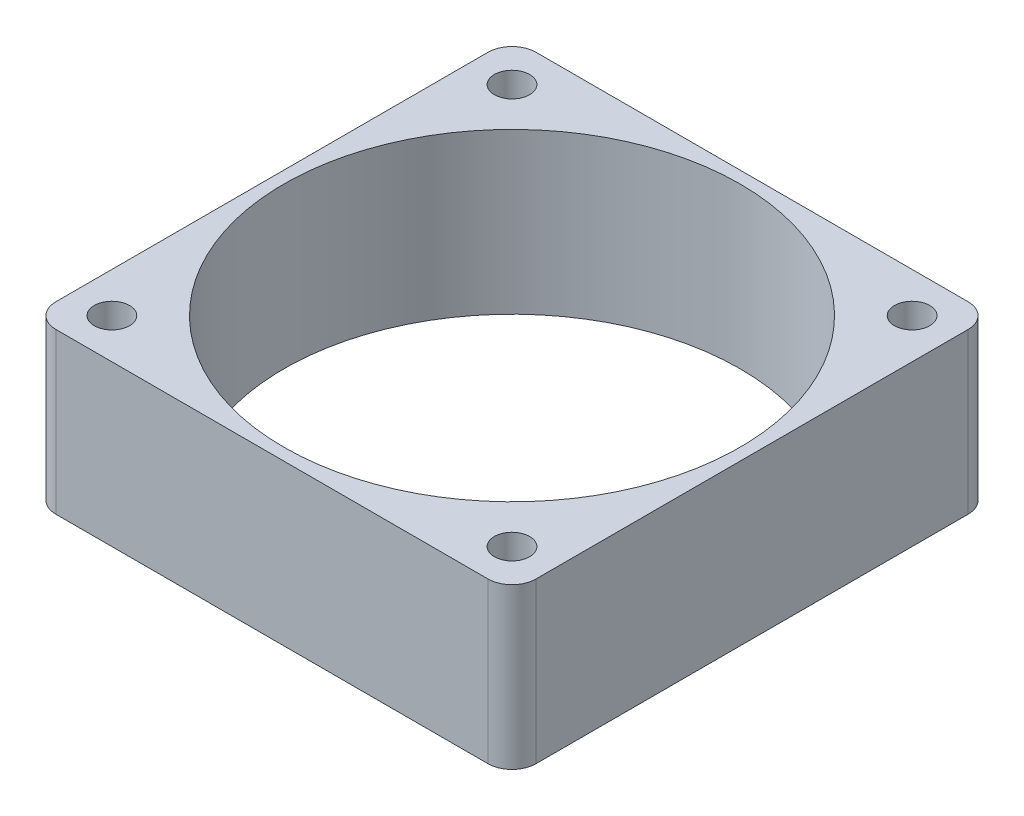
ISO-10303-21;
HEADER;
FILE_DESCRIPTION(('STEP AP214'),'2;1');
FILE_NAME('part.step','',(''),(''),'','','');
FILE_SCHEMA(('AUTOMOTIVE_DESIGN { 1 0 10303 214 1 1 1 1 }'));
ENDSEC;
DATA;
#1=APPLICATION_CONTEXT('core data for automotive mechanical design processes');
#2=APPLICATION_PROTOCOL_DEFINITION('international standard','automotive_design',2000,#1);
#3=PRODUCT_CONTEXT('',#1,'mechanical');
#4=PRODUCT('Part','Part','',(#3));
#5=PRODUCT_RELATED_PRODUCT_CATEGORY('part','',(#4));
#6=PRODUCT_DEFINITION_FORMATION('','',#4);
#7=PRODUCT_DEFINITION_CONTEXT('part definition',#1,'design');
#8=PRODUCT_DEFINITION('design','',#6,#7);
#9=PRODUCT_DEFINITION_SHAPE('','',#8);
#10=(LENGTH_UNIT() NAMED_UNIT(*) SI_UNIT(.MILLI.,.METRE.));
#11=(NAMED_UNIT(*) PLANE_ANGLE_UNIT() SI_UNIT($,.RADIAN.));
#12=(NAMED_UNIT(*) SI_UNIT($,.STERADIAN.) SOLID_ANGLE_UNIT());
#13=UNCERTAINTY_MEASURE_WITH_UNIT(LENGTH_MEASURE(1.E-05),#10,'distance_accuracy_value','');
#14=(GEOMETRIC_REPRESENTATION_CONTEXT(3) GLOBAL_UNCERTAINTY_ASSIGNED_CONTEXT((#13)) GLOBAL_UNIT_ASSIGNED_CONTEXT((#10,
#11,#12)) REPRESENTATION_CONTEXT('',''));
#15=CARTESIAN_POINT('',(0.,0.,0.));
#16=DIRECTION('',(0.,0.,1.));
#17=DIRECTION('',(1.,0.,0.));
#18=AXIS2_PLACEMENT_3D('',#15,#16,#17);
#19=CARTESIAN_POINT('',(0.,20.,0.));
#20=DIRECTION('',(0.,1.,0.));
#21=DIRECTION('',(0.,0.,1.));
#22=AXIS2_PLACEMENT_3D('',#19,#20,#21);
#23=PLANE('',#22);
#24=CARTESIAN_POINT('',(54.9999999999998,20.,5.));
#25=DIRECTION('',(0.,1.,0.));
#26=DIRECTION('',(0.,0.,1.));
#27=AXIS2_PLACEMENT_3D('',#24,#25,#26);
#28=CIRCLE('',#27,2.20000000000001);
#29=CARTESIAN_POINT('',(54.9999999999998,20.,7.2));
#30=VERTEX_POINT('',#29);
#31=EDGE_CURVE('E191',#30,#30,#28,.T.);
#32=ORIENTED_EDGE('',*,*,#31,.F.);
#33=EDGE_LOOP('',(#32));
#34=FACE_BOUND('',#33,.T.);
#35=CARTESIAN_POINT('',(30.,20.,30.));
#36=DIRECTION('',(0.,1.,0.));
#37=DIRECTION('',(0.,0.,1.));
#38=AXIS2_PLACEMENT_3D('',#35,#36,#37);
#39=CIRCLE('',#38,28.5);
#40=CARTESIAN_POINT('',(30.,20.,58.5));
#41=VERTEX_POINT('',#40);
#42=EDGE_CURVE('E180',#41,#41,#39,.T.);
#43=ORIENTED_EDGE('',*,*,#42,.F.);
#44=EDGE_LOOP('',(#43));
#45=FACE_BOUND('',#44,.T.);
#46=DIRECTION('',(-1.,0.,0.));
#47=VECTOR('',#46,1.);
#48=CARTESIAN_POINT('',(0.,20.,0.));
#49=LINE('',#48,#47);
#50=CARTESIAN_POINT('',(57.,20.,0.));
#51=VERTEX_POINT('',#50);
#52=CARTESIAN_POINT('',(3.,20.,0.));
#53=VERTEX_POINT('',#52);
#54=EDGE_CURVE('E135',#51,#53,#49,.T.);
#55=ORIENTED_EDGE('',*,*,#54,.T.);
#56=CARTESIAN_POINT('',(3.,20.,3.));
#57=DIRECTION('',(0.,1.,0.));
#58=DIRECTION('',(0.,0.,1.));
#59=AXIS2_PLACEMENT_3D('',#56,#57,#58);
#60=CIRCLE('',#59,3.);
#61=CARTESIAN_POINT('',(0.,20.,3.));
#62=VERTEX_POINT('',#61);
#63=EDGE_CURVE('E154',#53,#62,#60,.T.);
#64=ORIENTED_EDGE('',*,*,#63,.T.);
#65=DIRECTION('',(0.,0.,1.));
#66=VECTOR('',#65,1.);
#67=CARTESIAN_POINT('',(0.,20.,0.));
#68=LINE('',#67,#66);
#69=CARTESIAN_POINT('',(0.,20.,57.));
#70=VERTEX_POINT('',#69);
#71=EDGE_CURVE('E118',#62,#70,#68,.T.);
#72=ORIENTED_EDGE('',*,*,#71,.T.);
#73=CARTESIAN_POINT('',(3.,20.,57.));
#74=DIRECTION('',(0.,1.,0.));
#75=DIRECTION('',(0.,0.,1.));
#76=AXIS2_PLACEMENT_3D('',#73,#74,#75);
#77=CIRCLE('',#76,3.);
#78=CARTESIAN_POINT('',(3.,20.,60.));
#79=VERTEX_POINT('',#78);
#80=EDGE_CURVE('E149',#70,#79,#77,.T.);
#81=ORIENTED_EDGE('',*,*,#80,.T.);
#82=DIRECTION('',(1.,0.,0.));
#83=VECTOR('',#82,1.);
#84=CARTESIAN_POINT('',(0.,20.,60.));
#85=LINE('',#84,#83);
#86=CARTESIAN_POINT('',(57.,20.,60.));
#87=VERTEX_POINT('',#86);
#88=EDGE_CURVE('E165',#79,#87,#85,.T.);
#89=ORIENTED_EDGE('',*,*,#88,.T.);
#90=CARTESIAN_POINT('',(57.,20.,57.));
#91=DIRECTION('',(0.,1.,0.));
#92=DIRECTION('',(0.,0.,1.));
#93=AXIS2_PLACEMENT_3D('',#90,#91,#92);
#94=CIRCLE('',#93,3.);
#95=CARTESIAN_POINT('',(60.,20.,57.));
#96=VERTEX_POINT('',#95);
#97=EDGE_CURVE('E54',#87,#96,#94,.T.);
#98=ORIENTED_EDGE('',*,*,#97,.T.);
#99=DIRECTION('',(0.,0.,-1.));
#100=VECTOR('',#99,1.);
#101=CARTESIAN_POINT('',(60.,20.,0.));
#102=LINE('',#101,#100);
#103=CARTESIAN_POINT('',(60.,20.,3.));
#104=VERTEX_POINT('',#103);
#105=EDGE_CURVE('E173',#96,#104,#102,.T.);
#106=ORIENTED_EDGE('',*,*,#105,.T.);
#107=CARTESIAN_POINT('',(57.,20.,3.));
#108=DIRECTION('',(0.,1.,0.));
#109=DIRECTION('',(0.,0.,1.));
#110=AXIS2_PLACEMENT_3D('',#107,#108,#109);
#111=CIRCLE('',#110,3.);
#112=EDGE_CURVE('E152',#104,#51,#111,.T.);
#113=ORIENTED_EDGE('',*,*,#112,.T.);
#114=EDGE_LOOP('',(#55,#64,#72,#81,#89,#98,#106,#113));
#115=FACE_BOUND('',#114,.T.);
#116=CARTESIAN_POINT('',(5.00000000000001,20.,55.));
#117=DIRECTION('',(0.,1.,0.));
#118=DIRECTION('',(0.,0.,1.));
#119=AXIS2_PLACEMENT_3D('',#116,#117,#118);
#120=CIRCLE('',#119,2.2);
#121=CARTESIAN_POINT('',(5.00000000000001,20.,57.2));
#122=VERTEX_POINT('',#121);
#123=EDGE_CURVE('E126',#122,#122,#120,.T.);
#124=ORIENTED_EDGE('',*,*,#123,.F.);
#125=EDGE_LOOP('',(#124));
#126=FACE_BOUND('',#125,.T.);
#127=CARTESIAN_POINT('',(55.,20.,55.));
#128=DIRECTION('',(0.,1.,0.));
#129=DIRECTION('',(0.,0.,1.));
#130=AXIS2_PLACEMENT_3D('',#127,#128,#129);
#131=CIRCLE('',#130,2.2);
#132=CARTESIAN_POINT('',(55.,20.,57.2));
#133=VERTEX_POINT('',#132);
#134=EDGE_CURVE('E185',#133,#133,#131,.T.);
#135=ORIENTED_EDGE('',*,*,#134,.F.);
#136=EDGE_LOOP('',(#135));
#137=FACE_BOUND('',#136,.T.);
#138=CARTESIAN_POINT('',(4.99999999999983,20.,5.));
#139=DIRECTION('',(0.,1.,0.));
#140=DIRECTION('',(0.,0.,1.));
#141=AXIS2_PLACEMENT_3D('',#138,#139,#140);
#142=CIRCLE('',#141,2.2);
#143=CARTESIAN_POINT('',(4.99999999999983,20.,7.2));
#144=VERTEX_POINT('',#143);
#145=EDGE_CURVE('E197',#144,#144,#142,.T.);
#146=ORIENTED_EDGE('',*,*,#145,.F.);
#147=EDGE_LOOP('',(#146));
#148=FACE_BOUND('',#147,.T.);
#149=ADVANCED_FACE('F32',(#34,#45,#115,#126,#137,#148),#23,.T.);
#150=CARTESIAN_POINT('',(0.,0.,0.));
#151=DIRECTION('',(0.,1.,0.));
#152=DIRECTION('',(0.,0.,1.));
#153=AXIS2_PLACEMENT_3D('',#150,#151,#152);
#154=PLANE('',#153);
#155=DIRECTION('',(0.,0.,1.));
#156=VECTOR('',#155,1.);
#157=CARTESIAN_POINT('',(0.,0.,0.));
#158=LINE('',#157,#156);
#159=CARTESIAN_POINT('',(0.,0.,3.));
#160=VERTEX_POINT('',#159);
#161=CARTESIAN_POINT('',(0.,0.,57.));
#162=VERTEX_POINT('',#161);
#163=EDGE_CURVE('E115',#160,#162,#158,.T.);
#164=ORIENTED_EDGE('',*,*,#163,.F.);
#165=CARTESIAN_POINT('',(3.,0.,3.));
#166=DIRECTION('',(0.,1.,0.));
#167=DIRECTION('',(0.,0.,1.));
#168=AXIS2_PLACEMENT_3D('',#165,#166,#167);
#169=CIRCLE('',#168,3.);
#170=CARTESIAN_POINT('',(3.,0.,0.));
#171=VERTEX_POINT('',#170);
#172=EDGE_CURVE('E98',#160,#171,#169,.F.);
#173=ORIENTED_EDGE('',*,*,#172,.T.);
#174=DIRECTION('',(-1.,0.,0.));
#175=VECTOR('',#174,1.);
#176=CARTESIAN_POINT('',(0.,0.,0.));
#177=LINE('',#176,#175);
#178=CARTESIAN_POINT('',(57.,0.,0.));
#179=VERTEX_POINT('',#178);
#180=EDGE_CURVE('E139',#179,#171,#177,.T.);
#181=ORIENTED_EDGE('',*,*,#180,.F.);
#182=CARTESIAN_POINT('',(57.,0.,3.));
#183=DIRECTION('',(0.,1.,0.));
#184=DIRECTION('',(0.,0.,1.));
#185=AXIS2_PLACEMENT_3D('',#182,#183,#184);
#186=CIRCLE('',#185,3.);
#187=CARTESIAN_POINT('',(60.,0.,3.));
#188=VERTEX_POINT('',#187);
#189=EDGE_CURVE('E109',#179,#188,#186,.F.);
#190=ORIENTED_EDGE('',*,*,#189,.T.);
#191=DIRECTION('',(0.,0.,-1.));
#192=VECTOR('',#191,1.);
#193=CARTESIAN_POINT('',(60.,0.,0.));
#194=LINE('',#193,#192);
#195=CARTESIAN_POINT('',(60.,0.,57.));
#196=VERTEX_POINT('',#195);
#197=EDGE_CURVE('E129',#196,#188,#194,.T.);
#198=ORIENTED_EDGE('',*,*,#197,.F.);
#199=CARTESIAN_POINT('',(57.,0.,57.));
#200=DIRECTION('',(0.,1.,0.));
#201=DIRECTION('',(0.,0.,1.));
#202=AXIS2_PLACEMENT_3D('',#199,#200,#201);
#203=CIRCLE('',#202,3.);
#204=CARTESIAN_POINT('',(57.,0.,60.));
#205=VERTEX_POINT('',#204);
#206=EDGE_CURVE('E143',#196,#205,#203,.F.);
#207=ORIENTED_EDGE('',*,*,#206,.T.);
#208=DIRECTION('',(1.,0.,0.));
#209=VECTOR('',#208,1.);
#210=CARTESIAN_POINT('',(0.,0.,60.));
#211=LINE('',#210,#209);
#212=CARTESIAN_POINT('',(3.,0.,60.));
#213=VERTEX_POINT('',#212);
#214=EDGE_CURVE('E125',#213,#205,#211,.T.);
#215=ORIENTED_EDGE('',*,*,#214,.F.);
#216=CARTESIAN_POINT('',(3.,0.,57.));
#217=DIRECTION('',(0.,1.,0.));
#218=DIRECTION('',(0.,0.,1.));
#219=AXIS2_PLACEMENT_3D('',#216,#217,#218);
#220=CIRCLE('',#219,3.);
#221=EDGE_CURVE('E119',#213,#162,#220,.F.);
#222=ORIENTED_EDGE('',*,*,#221,.T.);
#223=EDGE_LOOP('',(#164,#173,#181,#190,#198,#207,#215,#222));
#224=FACE_BOUND('',#223,.T.);
#225=CARTESIAN_POINT('',(5.00000000000001,0.,55.));
#226=DIRECTION('',(0.,1.,0.));
#227=DIRECTION('',(0.,0.,1.));
#228=AXIS2_PLACEMENT_3D('',#225,#226,#227);
#229=CIRCLE('',#228,2.2);
#230=CARTESIAN_POINT('',(5.00000000000001,0.,57.2));
#231=VERTEX_POINT('',#230);
#232=EDGE_CURVE('E132',#231,#231,#229,.T.);
#233=ORIENTED_EDGE('',*,*,#232,.T.);
#234=EDGE_LOOP('',(#233));
#235=FACE_BOUND('',#234,.T.);
#236=CARTESIAN_POINT('',(30.,0.,30.));
#237=DIRECTION('',(0.,1.,0.));
#238=DIRECTION('',(0.,0.,1.));
#239=AXIS2_PLACEMENT_3D('',#236,#237,#238);
#240=CIRCLE('',#239,28.5);
#241=CARTESIAN_POINT('',(30.,0.,58.5));
#242=VERTEX_POINT('',#241);
#243=EDGE_CURVE('E182',#242,#242,#240,.T.);
#244=ORIENTED_EDGE('',*,*,#243,.T.);
#245=EDGE_LOOP('',(#244));
#246=FACE_BOUND('',#245,.T.);
#247=CARTESIAN_POINT('',(55.,0.,55.));
#248=DIRECTION('',(0.,1.,0.));
#249=DIRECTION('',(0.,0.,1.));
#250=AXIS2_PLACEMENT_3D('',#247,#248,#249);
#251=CIRCLE('',#250,2.2);
#252=CARTESIAN_POINT('',(55.,0.,57.2));
#253=VERTEX_POINT('',#252);
#254=EDGE_CURVE('E188',#253,#253,#251,.T.);
#255=ORIENTED_EDGE('',*,*,#254,.T.);
#256=EDGE_LOOP('',(#255));
#257=FACE_BOUND('',#256,.T.);
#258=CARTESIAN_POINT('',(54.9999999999998,0.,5.));
#259=DIRECTION('',(0.,1.,0.));
#260=DIRECTION('',(0.,0.,1.));
#261=AXIS2_PLACEMENT_3D('',#258,#259,#260);
#262=CIRCLE('',#261,2.20000000000001);
#263=CARTESIAN_POINT('',(54.9999999999998,0.,7.2));
#264=VERTEX_POINT('',#263);
#265=EDGE_CURVE('E194',#264,#264,#262,.T.);
#266=ORIENTED_EDGE('',*,*,#265,.T.);
#267=EDGE_LOOP('',(#266));
#268=FACE_BOUND('',#267,.T.);
#269=CARTESIAN_POINT('',(4.99999999999983,0.,5.));
#270=DIRECTION('',(0.,1.,0.));
#271=DIRECTION('',(0.,0.,1.));
#272=AXIS2_PLACEMENT_3D('',#269,#270,#271);
#273=CIRCLE('',#272,2.2);
#274=CARTESIAN_POINT('',(4.99999999999983,0.,7.2));
#275=VERTEX_POINT('',#274);
#276=EDGE_CURVE('E200',#275,#275,#273,.T.);
#277=ORIENTED_EDGE('',*,*,#276,.T.);
#278=EDGE_LOOP('',(#277));
#279=FACE_BOUND('',#278,.T.);
#280=ADVANCED_FACE('F122',(#224,#235,#246,#257,#268,#279),#154,.F.);
#281=CARTESIAN_POINT('',(0.,20.,0.));
#282=DIRECTION('',(1.,0.,0.));
#283=DIRECTION('',(0.,0.,-1.));
#284=AXIS2_PLACEMENT_3D('',#281,#282,#283);
#285=PLANE('',#284);
#286=ORIENTED_EDGE('',*,*,#71,.F.);
#287=DIRECTION('',(0.,-1.,0.));
#288=VECTOR('',#287,1.);
#289=CARTESIAN_POINT('',(0.,20.,3.));
#290=LINE('',#289,#288);
#291=EDGE_CURVE('E102',#62,#160,#290,.T.);
#292=ORIENTED_EDGE('',*,*,#291,.T.);
#293=ORIENTED_EDGE('',*,*,#163,.T.);
#294=DIRECTION('',(0.,-1.,0.));
#295=VECTOR('',#294,1.);
#296=CARTESIAN_POINT('',(0.,20.,57.));
#297=LINE('',#296,#295);
#298=EDGE_CURVE('E120',#162,#70,#297,.F.);
#299=ORIENTED_EDGE('',*,*,#298,.T.);
#300=EDGE_LOOP('',(#286,#292,#293,#299));
#301=FACE_BOUND('',#300,.T.);
#302=ADVANCED_FACE('F114',(#301),#285,.F.);
#303=CARTESIAN_POINT('',(0.,20.,60.));
#304=DIRECTION('',(0.,0.,-1.));
#305=DIRECTION('',(-1.,0.,0.));
#306=AXIS2_PLACEMENT_3D('',#303,#304,#305);
#307=PLANE('',#306);
#308=ORIENTED_EDGE('',*,*,#214,.T.);
#309=DIRECTION('',(0.,-1.,0.));
#310=VECTOR('',#309,1.);
#311=CARTESIAN_POINT('',(57.,20.,60.));
#312=LINE('',#311,#310);
#313=EDGE_CURVE('E11',#205,#87,#312,.F.);
#314=ORIENTED_EDGE('',*,*,#313,.T.);
#315=ORIENTED_EDGE('',*,*,#88,.F.);
#316=DIRECTION('',(0.,-1.,0.));
#317=VECTOR('',#316,1.);
#318=CARTESIAN_POINT('',(3.,20.,60.));
#319=LINE('',#318,#317);
#320=EDGE_CURVE('E40',#79,#213,#319,.T.);
#321=ORIENTED_EDGE('',*,*,#320,.T.);
#322=EDGE_LOOP('',(#308,#314,#315,#321));
#323=FACE_BOUND('',#322,.T.);
#324=ADVANCED_FACE('F163',(#323),#307,.F.);
#325=CARTESIAN_POINT('',(60.,20.,0.));
#326=DIRECTION('',(-1.,0.,0.));
#327=DIRECTION('',(0.,0.,1.));
#328=AXIS2_PLACEMENT_3D('',#325,#326,#327);
#329=PLANE('',#328);
#330=ORIENTED_EDGE('',*,*,#197,.T.);
#331=DIRECTION('',(0.,-1.,0.));
#332=VECTOR('',#331,1.);
#333=CARTESIAN_POINT('',(60.,20.,3.));
#334=LINE('',#333,#332);
#335=EDGE_CURVE('E47',#188,#104,#334,.F.);
#336=ORIENTED_EDGE('',*,*,#335,.T.);
#337=ORIENTED_EDGE('',*,*,#105,.F.);
#338=DIRECTION('',(0.,-1.,0.));
#339=VECTOR('',#338,1.);
#340=CARTESIAN_POINT('',(60.,20.,57.));
#341=LINE('',#340,#339);
#342=EDGE_CURVE('E156',#96,#196,#341,.T.);
#343=ORIENTED_EDGE('',*,*,#342,.T.);
#344=EDGE_LOOP('',(#330,#336,#337,#343));
#345=FACE_BOUND('',#344,.T.);
#346=ADVANCED_FACE('F172',(#345),#329,.F.);
#347=CARTESIAN_POINT('',(0.,20.,0.));
#348=DIRECTION('',(0.,0.,1.));
#349=DIRECTION('',(1.,0.,0.));
#350=AXIS2_PLACEMENT_3D('',#347,#348,#349);
#351=PLANE('',#350);
#352=ORIENTED_EDGE('',*,*,#180,.T.);
#353=DIRECTION('',(0.,-1.,0.));
#354=VECTOR('',#353,1.);
#355=CARTESIAN_POINT('',(3.,20.,0.));
#356=LINE('',#355,#354);
#357=EDGE_CURVE('E103',#171,#53,#356,.F.);
#358=ORIENTED_EDGE('',*,*,#357,.T.);
#359=ORIENTED_EDGE('',*,*,#54,.F.);
#360=DIRECTION('',(0.,-1.,0.));
#361=VECTOR('',#360,1.);
#362=CARTESIAN_POINT('',(57.,20.,0.));
#363=LINE('',#362,#361);
#364=EDGE_CURVE('E108',#51,#179,#363,.T.);
#365=ORIENTED_EDGE('',*,*,#364,.T.);
#366=EDGE_LOOP('',(#352,#358,#359,#365));
#367=FACE_BOUND('',#366,.T.);
#368=ADVANCED_FACE('F222',(#367),#351,.F.);
#369=CARTESIAN_POINT('',(5.00000000000001,20.,55.));
#370=DIRECTION('',(0.,-1.,0.));
#371=DIRECTION('',(0.,0.,-1.));
#372=AXIS2_PLACEMENT_3D('',#369,#370,#371);
#373=CYLINDRICAL_SURFACE('',#372,2.2);
#374=ORIENTED_EDGE('',*,*,#123,.T.);
#375=EDGE_LOOP('',(#374));
#376=FACE_BOUND('',#375,.T.);
#377=ORIENTED_EDGE('',*,*,#232,.F.);
#378=EDGE_LOOP('',(#377));
#379=FACE_BOUND('',#378,.T.);
#380=ADVANCED_FACE('F219',(#376,#379),#373,.F.);
#381=CARTESIAN_POINT('',(30.,20.,30.));
#382=DIRECTION('',(0.,-1.,0.));
#383=DIRECTION('',(0.,0.,-1.));
#384=AXIS2_PLACEMENT_3D('',#381,#382,#383);
#385=CYLINDRICAL_SURFACE('',#384,28.5);
#386=ORIENTED_EDGE('',*,*,#42,.T.);
#387=EDGE_LOOP('',(#386));
#388=FACE_BOUND('',#387,.T.);
#389=ORIENTED_EDGE('',*,*,#243,.F.);
#390=EDGE_LOOP('',(#389));
#391=FACE_BOUND('',#390,.T.);
#392=ADVANCED_FACE('F254',(#388,#391),#385,.F.);
#393=CARTESIAN_POINT('',(55.,20.,55.));
#394=DIRECTION('',(0.,-1.,0.));
#395=DIRECTION('',(0.,0.,-1.));
#396=AXIS2_PLACEMENT_3D('',#393,#394,#395);
#397=CYLINDRICAL_SURFACE('',#396,2.2);
#398=ORIENTED_EDGE('',*,*,#134,.T.);
#399=EDGE_LOOP('',(#398));
#400=FACE_BOUND('',#399,.T.);
#401=ORIENTED_EDGE('',*,*,#254,.F.);
#402=EDGE_LOOP('',(#401));
#403=FACE_BOUND('',#402,.T.);
#404=ADVANCED_FACE('F250',(#400,#403),#397,.F.);
#405=CARTESIAN_POINT('',(54.9999999999998,20.,5.));
#406=DIRECTION('',(0.,-1.,0.));
#407=DIRECTION('',(0.,0.,-1.));
#408=AXIS2_PLACEMENT_3D('',#405,#406,#407);
#409=CYLINDRICAL_SURFACE('',#408,2.20000000000001);
#410=ORIENTED_EDGE('',*,*,#31,.T.);
#411=EDGE_LOOP('',(#410));
#412=FACE_BOUND('',#411,.T.);
#413=ORIENTED_EDGE('',*,*,#265,.F.);
#414=EDGE_LOOP('',(#413));
#415=FACE_BOUND('',#414,.T.);
#416=ADVANCED_FACE('F253',(#412,#415),#409,.F.);
#417=CARTESIAN_POINT('',(4.99999999999983,20.,5.));
#418=DIRECTION('',(0.,-1.,0.));
#419=DIRECTION('',(0.,0.,-1.));
#420=AXIS2_PLACEMENT_3D('',#417,#418,#419);
#421=CYLINDRICAL_SURFACE('',#420,2.2);
#422=ORIENTED_EDGE('',*,*,#145,.T.);
#423=EDGE_LOOP('',(#422));
#424=FACE_BOUND('',#423,.T.);
#425=ORIENTED_EDGE('',*,*,#276,.F.);
#426=EDGE_LOOP('',(#425));
#427=FACE_BOUND('',#426,.T.);
#428=ADVANCED_FACE('F206',(#424,#427),#421,.F.);
#429=CARTESIAN_POINT('',(3.,20.,3.));
#430=DIRECTION('',(0.,-1.,0.));
#431=DIRECTION('',(0.,0.,-1.));
#432=AXIS2_PLACEMENT_3D('',#429,#430,#431);
#433=CYLINDRICAL_SURFACE('',#432,3.);
#434=ORIENTED_EDGE('',*,*,#63,.F.);
#435=ORIENTED_EDGE('',*,*,#357,.F.);
#436=ORIENTED_EDGE('',*,*,#172,.F.);
#437=ORIENTED_EDGE('',*,*,#291,.F.);
#438=EDGE_LOOP('',(#434,#435,#436,#437));
#439=FACE_BOUND('',#438,.T.);
#440=ADVANCED_FACE('F101',(#439),#433,.T.);
#441=CARTESIAN_POINT('',(57.,20.,3.));
#442=DIRECTION('',(0.,-1.,0.));
#443=DIRECTION('',(0.,0.,-1.));
#444=AXIS2_PLACEMENT_3D('',#441,#442,#443);
#445=CYLINDRICAL_SURFACE('',#444,3.);
#446=ORIENTED_EDGE('',*,*,#112,.F.);
#447=ORIENTED_EDGE('',*,*,#335,.F.);
#448=ORIENTED_EDGE('',*,*,#189,.F.);
#449=ORIENTED_EDGE('',*,*,#364,.F.);
#450=EDGE_LOOP('',(#446,#447,#448,#449));
#451=FACE_BOUND('',#450,.T.);
#452=ADVANCED_FACE('F234',(#451),#445,.T.);
#453=CARTESIAN_POINT('',(57.,20.,57.));
#454=DIRECTION('',(0.,-1.,0.));
#455=DIRECTION('',(0.,0.,-1.));
#456=AXIS2_PLACEMENT_3D('',#453,#454,#455);
#457=CYLINDRICAL_SURFACE('',#456,3.);
#458=ORIENTED_EDGE('',*,*,#97,.F.);
#459=ORIENTED_EDGE('',*,*,#313,.F.);
#460=ORIENTED_EDGE('',*,*,#206,.F.);
#461=ORIENTED_EDGE('',*,*,#342,.F.);
#462=EDGE_LOOP('',(#458,#459,#460,#461));
#463=FACE_BOUND('',#462,.T.);
#464=ADVANCED_FACE('F171',(#463),#457,.T.);
#465=CARTESIAN_POINT('',(3.,20.,57.));
#466=DIRECTION('',(0.,-1.,0.));
#467=DIRECTION('',(0.,0.,-1.));
#468=AXIS2_PLACEMENT_3D('',#465,#466,#467);
#469=CYLINDRICAL_SURFACE('',#468,3.);
#470=ORIENTED_EDGE('',*,*,#80,.F.);
#471=ORIENTED_EDGE('',*,*,#298,.F.);
#472=ORIENTED_EDGE('',*,*,#221,.F.);
#473=ORIENTED_EDGE('',*,*,#320,.F.);
#474=EDGE_LOOP('',(#470,#471,#472,#473));
#475=FACE_BOUND('',#474,.T.);
#476=ADVANCED_FACE('F34',(#475),#469,.T.);
#477=CLOSED_SHELL('',(#149,#280,#302,#324,#346,#368,#380,#392,#404,#416,#428,#440,#452,#464,#476));
#478=MANIFOLD_SOLID_BREP('B2',#477);
#479=ADVANCED_BREP_SHAPE_REPRESENTATION('',(#18,#478),#14);
#480=SHAPE_DEFINITION_REPRESENTATION(#9,#479);
ENDSEC;
END-ISO-10303-21;
